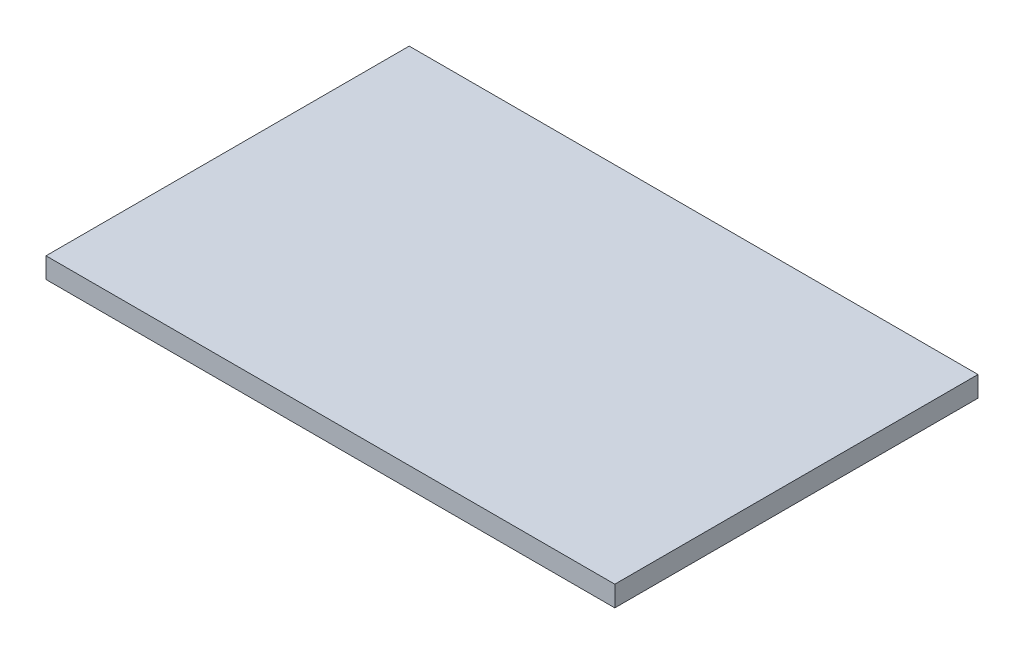
ISO-10303-21;
HEADER;
FILE_DESCRIPTION(('STEP AP214'),'2;1');
FILE_NAME('part.step','',(''),(''),'','','');
FILE_SCHEMA(('AUTOMOTIVE_DESIGN { 1 0 10303 214 1 1 1 1 }'));
ENDSEC;
DATA;
#1=APPLICATION_CONTEXT('core data for automotive mechanical design processes');
#2=APPLICATION_PROTOCOL_DEFINITION('international standard','automotive_design',2000,#1);
#3=PRODUCT_CONTEXT('',#1,'mechanical');
#4=PRODUCT('Part','Part','',(#3));
#5=PRODUCT_RELATED_PRODUCT_CATEGORY('part','',(#4));
#6=PRODUCT_DEFINITION_FORMATION('','',#4);
#7=PRODUCT_DEFINITION_CONTEXT('part definition',#1,'design');
#8=PRODUCT_DEFINITION('design','',#6,#7);
#9=PRODUCT_DEFINITION_SHAPE('','',#8);
#10=(LENGTH_UNIT() NAMED_UNIT(*) SI_UNIT(.MILLI.,.METRE.));
#11=(NAMED_UNIT(*) PLANE_ANGLE_UNIT() SI_UNIT($,.RADIAN.));
#12=(NAMED_UNIT(*) SI_UNIT($,.STERADIAN.) SOLID_ANGLE_UNIT());
#13=UNCERTAINTY_MEASURE_WITH_UNIT(LENGTH_MEASURE(1.E-05),#10,'distance_accuracy_value','');
#14=(GEOMETRIC_REPRESENTATION_CONTEXT(3) GLOBAL_UNCERTAINTY_ASSIGNED_CONTEXT((#13)) GLOBAL_UNIT_ASSIGNED_CONTEXT((#10,
#11,#12)) REPRESENTATION_CONTEXT('',''));
#15=CARTESIAN_POINT('',(0.,0.,0.));
#16=DIRECTION('',(0.,0.,1.));
#17=DIRECTION('',(1.,0.,0.));
#18=AXIS2_PLACEMENT_3D('',#15,#16,#17);
#19=CARTESIAN_POINT('',(-41.5,3.,-26.5));
#20=DIRECTION('',(1.,0.,0.));
#21=DIRECTION('',(0.,0.,-1.));
#22=AXIS2_PLACEMENT_3D('',#19,#20,#21);
#23=PLANE('',#22);
#24=DIRECTION('',(0.,0.,1.));
#25=VECTOR('',#24,1.);
#26=CARTESIAN_POINT('',(-41.5,0.,-26.5));
#27=LINE('',#26,#25);
#28=CARTESIAN_POINT('',(-41.5,0.,-26.5));
#29=VERTEX_POINT('',#28);
#30=CARTESIAN_POINT('',(-41.5,0.,26.5));
#31=VERTEX_POINT('',#30);
#32=EDGE_CURVE('E102',#29,#31,#27,.T.);
#33=ORIENTED_EDGE('',*,*,#32,.T.);
#34=DIRECTION('',(0.,-1.,0.));
#35=VECTOR('',#34,1.);
#36=CARTESIAN_POINT('',(-41.5,3.,26.5));
#37=LINE('',#36,#35);
#38=CARTESIAN_POINT('',(-41.5,3.,26.5));
#39=VERTEX_POINT('',#38);
#40=EDGE_CURVE('E11',#39,#31,#37,.T.);
#41=ORIENTED_EDGE('',*,*,#40,.F.);
#42=DIRECTION('',(0.,0.,1.));
#43=VECTOR('',#42,1.);
#44=CARTESIAN_POINT('',(-41.5,3.,-26.5));
#45=LINE('',#44,#43);
#46=CARTESIAN_POINT('',(-41.5,3.,-26.5));
#47=VERTEX_POINT('',#46);
#48=EDGE_CURVE('E90',#47,#39,#45,.T.);
#49=ORIENTED_EDGE('',*,*,#48,.F.);
#50=DIRECTION('',(0.,-1.,0.));
#51=VECTOR('',#50,1.);
#52=CARTESIAN_POINT('',(-41.5,3.,-26.5));
#53=LINE('',#52,#51);
#54=EDGE_CURVE('E98',#47,#29,#53,.T.);
#55=ORIENTED_EDGE('',*,*,#54,.T.);
#56=EDGE_LOOP('',(#33,#41,#49,#55));
#57=FACE_BOUND('',#56,.T.);
#58=ADVANCED_FACE('F39',(#57),#23,.F.);
#59=CARTESIAN_POINT('',(41.5,3.,26.5));
#60=DIRECTION('',(0.,0.,-1.));
#61=DIRECTION('',(-1.,0.,0.));
#62=AXIS2_PLACEMENT_3D('',#59,#60,#61);
#63=PLANE('',#62);
#64=DIRECTION('',(1.,0.,0.));
#65=VECTOR('',#64,1.);
#66=CARTESIAN_POINT('',(41.5,0.,26.5));
#67=LINE('',#66,#65);
#68=CARTESIAN_POINT('',(41.5,0.,26.5));
#69=VERTEX_POINT('',#68);
#70=EDGE_CURVE('E94',#31,#69,#67,.T.);
#71=ORIENTED_EDGE('',*,*,#70,.T.);
#72=DIRECTION('',(0.,-1.,0.));
#73=VECTOR('',#72,1.);
#74=CARTESIAN_POINT('',(41.5,3.,26.5));
#75=LINE('',#74,#73);
#76=CARTESIAN_POINT('',(41.5,3.,26.5));
#77=VERTEX_POINT('',#76);
#78=EDGE_CURVE('E47',#77,#69,#75,.T.);
#79=ORIENTED_EDGE('',*,*,#78,.F.);
#80=DIRECTION('',(1.,0.,0.));
#81=VECTOR('',#80,1.);
#82=CARTESIAN_POINT('',(41.5,3.,26.5));
#83=LINE('',#82,#81);
#84=EDGE_CURVE('E85',#39,#77,#83,.T.);
#85=ORIENTED_EDGE('',*,*,#84,.F.);
#86=ORIENTED_EDGE('',*,*,#40,.T.);
#87=EDGE_LOOP('',(#71,#79,#85,#86));
#88=FACE_BOUND('',#87,.T.);
#89=ADVANCED_FACE('F93',(#88),#63,.F.);
#90=CARTESIAN_POINT('',(41.5,3.,-26.5));
#91=DIRECTION('',(-1.,0.,0.));
#92=DIRECTION('',(0.,0.,1.));
#93=AXIS2_PLACEMENT_3D('',#90,#91,#92);
#94=PLANE('',#93);
#95=DIRECTION('',(0.,0.,-1.));
#96=VECTOR('',#95,1.);
#97=CARTESIAN_POINT('',(41.5,0.,-26.5));
#98=LINE('',#97,#96);
#99=CARTESIAN_POINT('',(41.5,0.,-26.5));
#100=VERTEX_POINT('',#99);
#101=EDGE_CURVE('E72',#69,#100,#98,.T.);
#102=ORIENTED_EDGE('',*,*,#101,.T.);
#103=DIRECTION('',(0.,-1.,0.));
#104=VECTOR('',#103,1.);
#105=CARTESIAN_POINT('',(41.5,3.,-26.5));
#106=LINE('',#105,#104);
#107=CARTESIAN_POINT('',(41.5,3.,-26.5));
#108=VERTEX_POINT('',#107);
#109=EDGE_CURVE('E95',#108,#100,#106,.T.);
#110=ORIENTED_EDGE('',*,*,#109,.F.);
#111=DIRECTION('',(0.,0.,-1.));
#112=VECTOR('',#111,1.);
#113=CARTESIAN_POINT('',(41.5,3.,-26.5));
#114=LINE('',#113,#112);
#115=EDGE_CURVE('E88',#77,#108,#114,.T.);
#116=ORIENTED_EDGE('',*,*,#115,.F.);
#117=ORIENTED_EDGE('',*,*,#78,.T.);
#118=EDGE_LOOP('',(#102,#110,#116,#117));
#119=FACE_BOUND('',#118,.T.);
#120=ADVANCED_FACE('F96',(#119),#94,.F.);
#121=CARTESIAN_POINT('',(41.5,3.,-26.5));
#122=DIRECTION('',(0.,0.,1.));
#123=DIRECTION('',(1.,0.,0.));
#124=AXIS2_PLACEMENT_3D('',#121,#122,#123);
#125=PLANE('',#124);
#126=DIRECTION('',(-1.,0.,0.));
#127=VECTOR('',#126,1.);
#128=CARTESIAN_POINT('',(41.5,0.,-26.5));
#129=LINE('',#128,#127);
#130=EDGE_CURVE('E78',#100,#29,#129,.T.);
#131=ORIENTED_EDGE('',*,*,#130,.T.);
#132=ORIENTED_EDGE('',*,*,#54,.F.);
#133=DIRECTION('',(-1.,0.,0.));
#134=VECTOR('',#133,1.);
#135=CARTESIAN_POINT('',(41.5,3.,-26.5));
#136=LINE('',#135,#134);
#137=EDGE_CURVE('E55',#108,#47,#136,.T.);
#138=ORIENTED_EDGE('',*,*,#137,.F.);
#139=ORIENTED_EDGE('',*,*,#109,.T.);
#140=EDGE_LOOP('',(#131,#132,#138,#139));
#141=FACE_BOUND('',#140,.T.);
#142=ADVANCED_FACE('F109',(#141),#125,.F.);
#143=CARTESIAN_POINT('',(0.,3.,0.));
#144=DIRECTION('',(0.,-1.,0.));
#145=DIRECTION('',(0.,0.,-1.));
#146=AXIS2_PLACEMENT_3D('',#143,#144,#145);
#147=PLANE('',#146);
#148=ORIENTED_EDGE('',*,*,#48,.T.);
#149=ORIENTED_EDGE('',*,*,#84,.T.);
#150=ORIENTED_EDGE('',*,*,#115,.T.);
#151=ORIENTED_EDGE('',*,*,#137,.T.);
#152=EDGE_LOOP('',(#148,#149,#150,#151));
#153=FACE_BOUND('',#152,.T.);
#154=ADVANCED_FACE('F86',(#153),#147,.F.);
#155=CARTESIAN_POINT('',(0.,0.,0.));
#156=DIRECTION('',(0.,-1.,0.));
#157=DIRECTION('',(0.,0.,-1.));
#158=AXIS2_PLACEMENT_3D('',#155,#156,#157);
#159=PLANE('',#158);
#160=ORIENTED_EDGE('',*,*,#32,.F.);
#161=ORIENTED_EDGE('',*,*,#130,.F.);
#162=ORIENTED_EDGE('',*,*,#101,.F.);
#163=ORIENTED_EDGE('',*,*,#70,.F.);
#164=EDGE_LOOP('',(#160,#161,#162,#163));
#165=FACE_BOUND('',#164,.T.);
#166=ADVANCED_FACE('F112',(#165),#159,.T.);
#167=CLOSED_SHELL('',(#58,#89,#120,#142,#154,#166));
#168=MANIFOLD_SOLID_BREP('B2',#167);
#169=ADVANCED_BREP_SHAPE_REPRESENTATION('',(#18,#168),#14);
#170=SHAPE_DEFINITION_REPRESENTATION(#9,#169);
ENDSEC;
END-ISO-10303-21;
